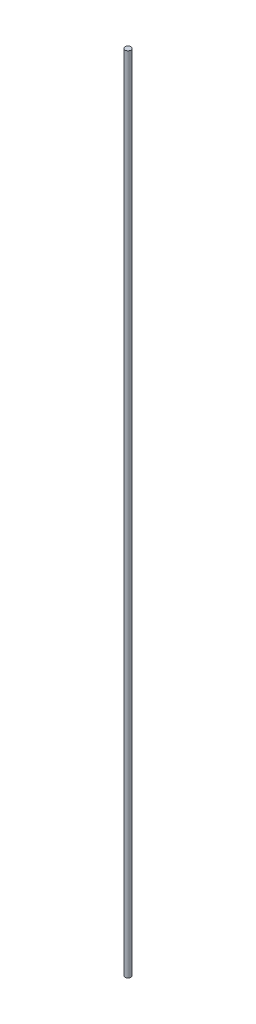
ISO-10303-21;
HEADER;
FILE_DESCRIPTION(('STEP AP214'),'2;1');
FILE_NAME('part.step','',(''),(''),'','','');
FILE_SCHEMA(('AUTOMOTIVE_DESIGN { 1 0 10303 214 1 1 1 1 }'));
ENDSEC;
DATA;
#1=APPLICATION_CONTEXT('core data for automotive mechanical design processes');
#2=APPLICATION_PROTOCOL_DEFINITION('international standard','automotive_design',2000,#1);
#3=PRODUCT_CONTEXT('',#1,'mechanical');
#4=PRODUCT('Part','Part','',(#3));
#5=PRODUCT_RELATED_PRODUCT_CATEGORY('part','',(#4));
#6=PRODUCT_DEFINITION_FORMATION('','',#4);
#7=PRODUCT_DEFINITION_CONTEXT('part definition',#1,'design');
#8=PRODUCT_DEFINITION('design','',#6,#7);
#9=PRODUCT_DEFINITION_SHAPE('','',#8);
#10=(LENGTH_UNIT() NAMED_UNIT(*) SI_UNIT(.MILLI.,.METRE.));
#11=(NAMED_UNIT(*) PLANE_ANGLE_UNIT() SI_UNIT($,.RADIAN.));
#12=(NAMED_UNIT(*) SI_UNIT($,.STERADIAN.) SOLID_ANGLE_UNIT());
#13=UNCERTAINTY_MEASURE_WITH_UNIT(LENGTH_MEASURE(1.E-05),#10,'distance_accuracy_value','');
#14=(GEOMETRIC_REPRESENTATION_CONTEXT(3) GLOBAL_UNCERTAINTY_ASSIGNED_CONTEXT((#13)) GLOBAL_UNIT_ASSIGNED_CONTEXT((#10,
#11,#12)) REPRESENTATION_CONTEXT('',''));
#15=CARTESIAN_POINT('',(0.,0.,0.));
#16=DIRECTION('',(0.,0.,1.));
#17=DIRECTION('',(1.,0.,0.));
#18=AXIS2_PLACEMENT_3D('',#15,#16,#17);
#19=CARTESIAN_POINT('',(0.,304.8,0.));
#20=DIRECTION('',(0.,-1.,0.));
#21=DIRECTION('',(0.,0.,-1.));
#22=AXIS2_PLACEMENT_3D('',#19,#20,#21);
#23=CYLINDRICAL_SURFACE('',#22,1.13);
#24=CARTESIAN_POINT('',(0.,304.8,0.));
#25=DIRECTION('',(0.,1.,0.));
#26=DIRECTION('',(0.,0.,1.));
#27=AXIS2_PLACEMENT_3D('',#24,#25,#26);
#28=CIRCLE('',#27,1.13);
#29=CARTESIAN_POINT('',(0.,304.8,-1.13));
#30=VERTEX_POINT('',#29);
#31=EDGE_CURVE('E10',#30,#30,#28,.T.);
#32=CARTESIAN_POINT('',(0.,0.,0.));
#33=DIRECTION('',(0.,1.,0.));
#34=DIRECTION('',(0.,0.,1.));
#35=AXIS2_PLACEMENT_3D('',#32,#33,#34);
#36=CIRCLE('',#35,1.13);
#37=CARTESIAN_POINT('',(0.,0.,-1.13));
#38=VERTEX_POINT('',#37);
#39=EDGE_CURVE('E34',#38,#38,#36,.T.);
#40=CARTESIAN_POINT('',(0.,304.8,-1.13));
#41=CARTESIAN_POINT('',(0.,301.625,-1.13));
#42=CARTESIAN_POINT('',(0.,298.45,-1.13));
#43=CARTESIAN_POINT('',(0.,292.1,-1.13));
#44=CARTESIAN_POINT('',(0.,288.925,-1.13));
#45=CARTESIAN_POINT('',(0.,282.575,-1.13));
#46=CARTESIAN_POINT('',(0.,279.4,-1.13));
#47=CARTESIAN_POINT('',(0.,273.05,-1.13));
#48=CARTESIAN_POINT('',(0.,269.875,-1.13));
#49=CARTESIAN_POINT('',(0.,263.525,-1.13));
#50=CARTESIAN_POINT('',(0.,260.35,-1.13));
#51=CARTESIAN_POINT('',(0.,254.,-1.13));
#52=CARTESIAN_POINT('',(0.,250.825,-1.13));
#53=CARTESIAN_POINT('',(0.,244.475,-1.13));
#54=CARTESIAN_POINT('',(0.,241.3,-1.13));
#55=CARTESIAN_POINT('',(0.,234.95,-1.13));
#56=CARTESIAN_POINT('',(0.,231.775,-1.13));
#57=CARTESIAN_POINT('',(0.,225.425,-1.13));
#58=CARTESIAN_POINT('',(0.,222.25,-1.13));
#59=CARTESIAN_POINT('',(0.,215.9,-1.13));
#60=CARTESIAN_POINT('',(0.,212.725,-1.13));
#61=CARTESIAN_POINT('',(0.,206.375,-1.13));
#62=CARTESIAN_POINT('',(0.,203.2,-1.13));
#63=CARTESIAN_POINT('',(0.,196.85,-1.13));
#64=CARTESIAN_POINT('',(0.,193.675,-1.13));
#65=CARTESIAN_POINT('',(0.,187.325,-1.13));
#66=CARTESIAN_POINT('',(0.,184.15,-1.13));
#67=CARTESIAN_POINT('',(0.,177.8,-1.13));
#68=CARTESIAN_POINT('',(0.,174.625,-1.13));
#69=CARTESIAN_POINT('',(0.,168.275,-1.13));
#70=CARTESIAN_POINT('',(0.,165.1,-1.13));
#71=CARTESIAN_POINT('',(0.,158.75,-1.13));
#72=CARTESIAN_POINT('',(0.,155.575,-1.13));
#73=CARTESIAN_POINT('',(0.,149.225,-1.13));
#74=CARTESIAN_POINT('',(0.,146.05,-1.13));
#75=CARTESIAN_POINT('',(0.,139.7,-1.13));
#76=CARTESIAN_POINT('',(0.,136.525,-1.13));
#77=CARTESIAN_POINT('',(0.,130.175,-1.13));
#78=CARTESIAN_POINT('',(0.,127.,-1.13));
#79=CARTESIAN_POINT('',(0.,120.65,-1.13));
#80=CARTESIAN_POINT('',(0.,117.475,-1.13));
#81=CARTESIAN_POINT('',(0.,111.125,-1.13));
#82=CARTESIAN_POINT('',(0.,107.95,-1.13));
#83=CARTESIAN_POINT('',(0.,101.6,-1.13));
#84=CARTESIAN_POINT('',(0.,98.425,-1.13));
#85=CARTESIAN_POINT('',(0.,92.075,-1.13));
#86=CARTESIAN_POINT('',(0.,88.9,-1.13));
#87=CARTESIAN_POINT('',(0.,82.55,-1.13));
#88=CARTESIAN_POINT('',(0.,79.375,-1.13));
#89=CARTESIAN_POINT('',(0.,73.025,-1.13));
#90=CARTESIAN_POINT('',(0.,69.85,-1.13));
#91=CARTESIAN_POINT('',(0.,63.5,-1.13));
#92=CARTESIAN_POINT('',(0.,60.325,-1.13));
#93=CARTESIAN_POINT('',(0.,53.975,-1.13));
#94=CARTESIAN_POINT('',(0.,50.8,-1.13));
#95=CARTESIAN_POINT('',(0.,44.45,-1.13));
#96=CARTESIAN_POINT('',(0.,41.275,-1.13));
#97=CARTESIAN_POINT('',(0.,34.925,-1.13));
#98=CARTESIAN_POINT('',(0.,31.75,-1.13));
#99=CARTESIAN_POINT('',(0.,25.4,-1.13));
#100=CARTESIAN_POINT('',(0.,22.225,-1.13));
#101=CARTESIAN_POINT('',(0.,15.875,-1.13));
#102=CARTESIAN_POINT('',(0.,12.7,-1.13));
#103=CARTESIAN_POINT('',(0.,6.35,-1.13));
#104=CARTESIAN_POINT('',(0.,3.175,-1.13));
#105=CARTESIAN_POINT('',(0.,0.,-1.13));
#106=B_SPLINE_CURVE_WITH_KNOTS('',3,(#40,#41,#42,#43,#44,#45,#46,#47,#48,#49,#50,#51,#52,#53,
#54,#55,#56,#57,#58,#59,#60,#61,#62,#63,#64,#65,#66,#67,#68,#69,#70,#71,#72,#73,#74,#75,#76,#77,
#78,#79,#80,#81,#82,#83,#84,#85,#86,#87,#88,#89,#90,#91,#92,#93,#94,#95,#96,#97,#98,#99,#100,
#101,#102,#103,#104,#105),.UNSPECIFIED.,.F.,.F.,(4,2,2,2,2,2,2,2,2,2,2,2,2,2,2,2,2,2,2,2,2,2,2,
2,2,2,2,2,2,2,2,2,4),(0.,9.52500000000001,19.05,28.575,38.1,47.625,57.15,66.675,76.2,
85.7250000000001,95.2500000000001,104.775,114.3,123.825,133.35,142.875,152.4,161.925,171.45,
180.975,190.5,200.025,209.55,219.075,228.6,238.125,247.65,257.175,266.7,276.225,285.75,295.275,
304.8),.UNSPECIFIED.);
#107=EDGE_CURVE('BSEAM31',#30,#38,#106,.T.);
#108=ORIENTED_EDGE('',*,*,#31,.F.);
#109=ORIENTED_EDGE('',*,*,#39,.T.);
#110=ORIENTED_EDGE('',*,*,#107,.T.);
#111=ORIENTED_EDGE('',*,*,#107,.F.);
#112=EDGE_LOOP('',(#108,#110,#109,#111));
#113=FACE_BOUND('',#112,.T.);
#114=ADVANCED_FACE('F31',(#113),#23,.T.);
#115=CARTESIAN_POINT('',(0.,304.8,0.));
#116=DIRECTION('',(0.,1.,0.));
#117=DIRECTION('',(0.,0.,1.));
#118=AXIS2_PLACEMENT_3D('',#115,#116,#117);
#119=PLANE('',#118);
#120=ORIENTED_EDGE('',*,*,#31,.T.);
#121=EDGE_LOOP('',(#120));
#122=FACE_BOUND('',#121,.T.);
#123=ADVANCED_FACE('F46',(#122),#119,.T.);
#124=CARTESIAN_POINT('',(0.,0.,0.));
#125=DIRECTION('',(0.,1.,0.));
#126=DIRECTION('',(0.,0.,1.));
#127=AXIS2_PLACEMENT_3D('',#124,#125,#126);
#128=PLANE('',#127);
#129=ORIENTED_EDGE('',*,*,#39,.F.);
#130=EDGE_LOOP('',(#129));
#131=FACE_BOUND('',#130,.T.);
#132=ADVANCED_FACE('F44',(#131),#128,.F.);
#133=CLOSED_SHELL('',(#114,#123,#132));
#134=MANIFOLD_SOLID_BREP('B2',#133);
#135=ADVANCED_BREP_SHAPE_REPRESENTATION('',(#18,#134),#14);
#136=SHAPE_DEFINITION_REPRESENTATION(#9,#135);
ENDSEC;
END-ISO-10303-21;
